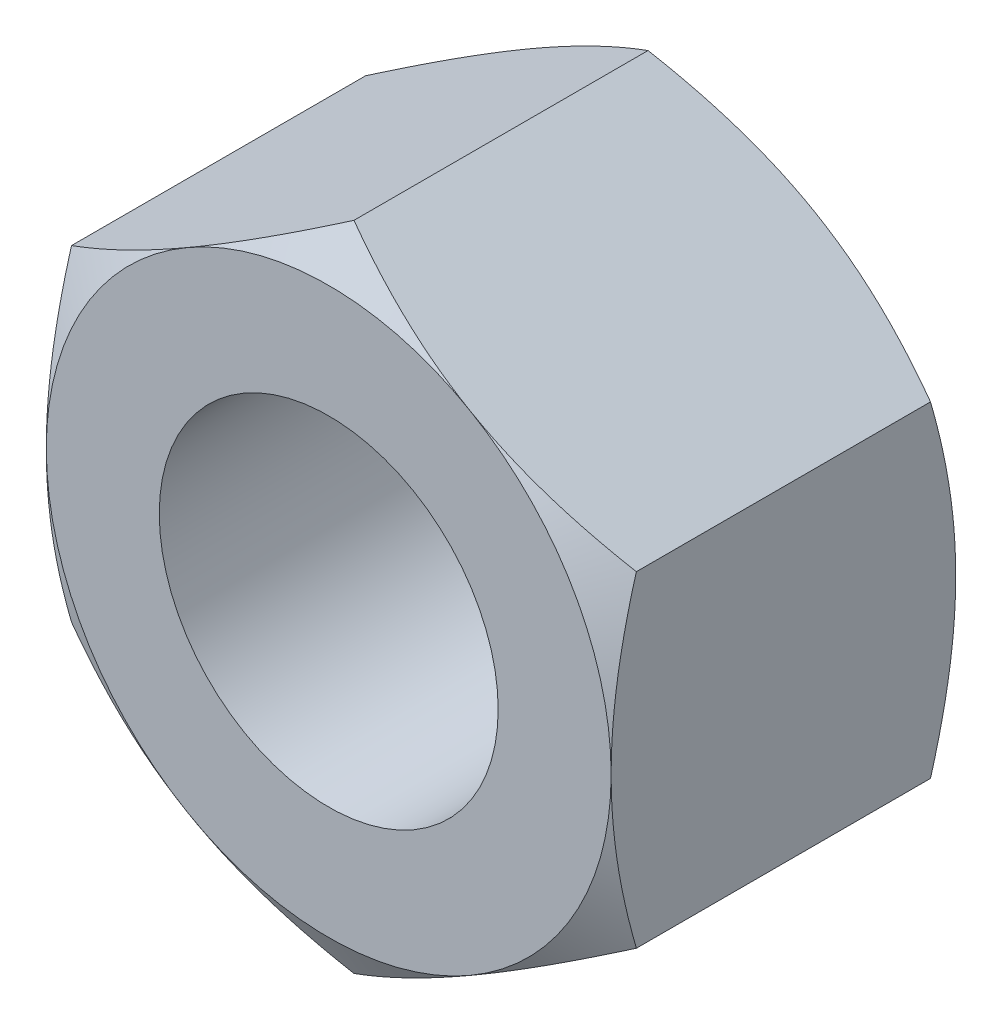
ISO-10303-21;
HEADER;
FILE_DESCRIPTION(('STEP AP214'),'2;1');
FILE_NAME('part.step','',(''),(''),'','','');
FILE_SCHEMA(('AUTOMOTIVE_DESIGN { 1 0 10303 214 1 1 1 1 }'));
ENDSEC;
DATA;
#1=APPLICATION_CONTEXT('core data for automotive mechanical design processes');
#2=APPLICATION_PROTOCOL_DEFINITION('international standard','automotive_design',2000,#1);
#3=PRODUCT_CONTEXT('',#1,'mechanical');
#4=PRODUCT('Part','Part','',(#3));
#5=PRODUCT_RELATED_PRODUCT_CATEGORY('part','',(#4));
#6=PRODUCT_DEFINITION_FORMATION('','',#4);
#7=PRODUCT_DEFINITION_CONTEXT('part definition',#1,'design');
#8=PRODUCT_DEFINITION('design','',#6,#7);
#9=PRODUCT_DEFINITION_SHAPE('','',#8);
#10=(LENGTH_UNIT() NAMED_UNIT(*) SI_UNIT(.MILLI.,.METRE.));
#11=(NAMED_UNIT(*) PLANE_ANGLE_UNIT() SI_UNIT($,.RADIAN.));
#12=(NAMED_UNIT(*) SI_UNIT($,.STERADIAN.) SOLID_ANGLE_UNIT());
#13=UNCERTAINTY_MEASURE_WITH_UNIT(LENGTH_MEASURE(1.E-05),#10,'distance_accuracy_value','');
#14=(GEOMETRIC_REPRESENTATION_CONTEXT(3) GLOBAL_UNCERTAINTY_ASSIGNED_CONTEXT((#13)) GLOBAL_UNIT_ASSIGNED_CONTEXT((#10,
#11,#12)) REPRESENTATION_CONTEXT('',''));
#15=CARTESIAN_POINT('',(0.,0.,0.));
#16=DIRECTION('',(0.,0.,1.));
#17=DIRECTION('',(1.,0.,0.));
#18=AXIS2_PLACEMENT_3D('',#15,#16,#17);
#19=CARTESIAN_POINT('',(-4.44089209850063E-13,5.77350269189662,-6.09999999999961));
#20=DIRECTION('',(-0.500000000000003,0.866025403784439,0.));
#21=DIRECTION('',(-0.86602540378444,-0.500000000000003,0.));
#22=AXIS2_PLACEMENT_3D('',#19,#20,#21);
#23=PLANE('',#22);
#24=DIRECTION('',(0.,0.,1.));
#25=VECTOR('',#24,1.);
#26=CARTESIAN_POINT('',(-5.00000000000037,2.88675134594854,-6.09999999999978));
#27=LINE('',#26,#25);
#28=CARTESIAN_POINT('',(-5.00000000000008,2.88675134594844,-5.65341801261451));
#29=VERTEX_POINT('',#28);
#30=CARTESIAN_POINT('',(-5.00000000000018,2.88675134594836,-0.446581987384988));
#31=VERTEX_POINT('',#30);
#32=EDGE_CURVE('E179',#29,#31,#27,.T.);
#33=ORIENTED_EDGE('',*,*,#32,.T.);
#34=CARTESIAN_POINT('',(-5.00020000000022,2.88663587589458,-0.446648656051575));
#35=CARTESIAN_POINT('',(-4.78046540547503,3.01349970319407,-0.373386567637683));
#36=CARTESIAN_POINT('',(-4.55885141554065,3.14144859993893,-0.306751321918298));
#37=CARTESIAN_POINT('',(-4.11178600454673,3.3995619353217,-0.190438991011152));
#38=CARTESIAN_POINT('',(-3.88632664040946,3.52973095989768,-0.140803049916111));
#39=CARTESIAN_POINT('',(-3.43816769477669,3.78847564779844,-0.0635510254189462));
#40=CARTESIAN_POINT('',(-3.21553790689598,3.91701101576094,-0.0354203782836819));
#41=CARTESIAN_POINT('',(-2.88081009815359,4.11026620624374,-0.0101949219540346));
#42=CARTESIAN_POINT('',(-2.76915780319521,4.17472868879368,-0.00461345976992652));
#43=CARTESIAN_POINT('',(-2.54575002932639,4.30371322717566,0.000797783248367124));
#44=CARTESIAN_POINT('',(-2.43399455370975,4.36823528110603,0.000627741742006714));
#45=CARTESIAN_POINT('',(-2.12781576914937,4.54500768479186,-0.00775363179151925));
#46=CARTESIAN_POINT('',(-1.93349391403306,4.65719946015319,-0.0218297718973291));
#47=CARTESIAN_POINT('',(-1.54613989800279,4.88083840558032,-0.0664652571099277));
#48=CARTESIAN_POINT('',(-1.35310909862887,4.99228478956061,-0.0970398601478299));
#49=CARTESIAN_POINT('',(-0.964974657525557,5.21637431361327,-0.173468493621365));
#50=CARTESIAN_POINT('',(-0.769920001358703,5.32898917185793,-0.219646378878941));
#51=CARTESIAN_POINT('',(-0.382719654641699,5.55253939626534,-0.324451794492138));
#52=CARTESIAN_POINT('',(-0.190569004592382,5.66347762579628,-0.383054703437459));
#53=CARTESIAN_POINT('',(0.000199999999631051,5.77361816195039,-0.446648656051506));
#54=B_SPLINE_CURVE_WITH_KNOTS('',3,(#34,#35,#36,#37,#38,#39,#40,#41,#42,#43,#44,#45,#46,#47,#48,
#49,#50,#51,#52,#53),.UNSPECIFIED.,.F.,.F.,(4,2,2,2,2,2,2,2,2,4),(0.,0.792555841363004,
1.5870166005333,2.36181537487278,2.7488407607732,3.13585419177284,3.80962362599659,
4.48401723901164,5.17336882348902,5.86136694793687),.UNSPECIFIED.);
#55=CARTESIAN_POINT('',(-2.50000000000021,4.33012701892242,0.));
#56=VERTEX_POINT('',#55);
#57=EDGE_CURVE('E140',#31,#56,#54,.T.);
#58=ORIENTED_EDGE('',*,*,#57,.T.);
#59=CARTESIAN_POINT('',(-5.13478148889135E-13,5.77350269189635,-0.446581987384863));
#60=VERTEX_POINT('',#59);
#61=EDGE_CURVE('E59',#56,#60,#54,.T.);
#62=ORIENTED_EDGE('',*,*,#61,.T.);
#63=DIRECTION('',(0.,0.,1.));
#64=VECTOR('',#63,1.);
#65=CARTESIAN_POINT('',(-4.44089209850063E-13,5.77350269189662,-6.09999999999961));
#66=LINE('',#65,#64);
#67=CARTESIAN_POINT('',(-3.81639164714898E-13,5.77350269189633,-5.65341801261445));
#68=VERTEX_POINT('',#67);
#69=EDGE_CURVE('E158',#68,#60,#66,.T.);
#70=ORIENTED_EDGE('',*,*,#69,.F.);
#71=CARTESIAN_POINT('',(-5.00020000000016,2.88663587589454,-5.65335134394793));
#72=CARTESIAN_POINT('',(-4.78046540547506,3.01349970319405,-5.72661343236218));
#73=CARTESIAN_POINT('',(-4.5588514155407,3.1414485999389,-5.79324867808174));
#74=CARTESIAN_POINT('',(-4.11178600454681,3.39956193532165,-5.90956100898904));
#75=CARTESIAN_POINT('',(-3.88632664040955,3.5297309598976,-5.95919695008405));
#76=CARTESIAN_POINT('',(-3.43816769477683,3.78847564779838,-6.03644897458111));
#77=CARTESIAN_POINT('',(-3.21553790689616,3.91701101576093,-6.06457962171629));
#78=CARTESIAN_POINT('',(-2.88081009815371,4.11026620624363,-6.08980507804613));
#79=CARTESIAN_POINT('',(-2.76915780319529,4.17472868879351,-6.09538654023036));
#80=CARTESIAN_POINT('',(-2.54575002932656,4.30371322717568,-6.10079778324829));
#81=CARTESIAN_POINT('',(-2.43399455371005,4.3682352811063,-6.10062774174144));
#82=CARTESIAN_POINT('',(-2.12781576914973,4.54500768479236,-6.09224636820751));
#83=CARTESIAN_POINT('',(-1.93349391403315,4.65719946015334,-6.07817022810247));
#84=CARTESIAN_POINT('',(-1.54613989800266,4.8808384055802,-6.03353474289042));
#85=CARTESIAN_POINT('',(-1.35310909862881,4.99228478956058,-6.00296013985229));
#86=CARTESIAN_POINT('',(-0.964974657525561,5.21637431361334,-5.92653150637861));
#87=CARTESIAN_POINT('',(-0.769920001358709,5.328989171858,-5.88035362112111));
#88=CARTESIAN_POINT('',(-0.382719654641654,5.5525393962653,-5.77554820550786));
#89=CARTESIAN_POINT('',(-0.190569004592283,5.66347762579611,-5.71694529656241));
#90=CARTESIAN_POINT('',(0.00019999999976289,5.77361816195001,-5.65335134394786));
#91=B_SPLINE_CURVE_WITH_KNOTS('',3,(#71,#72,#73,#74,#75,#76,#77,#78,#79,#80,#81,#82,#83,#84,#85,
#86,#87,#88,#89,#90),.UNSPECIFIED.,.F.,.F.,(4,2,2,2,2,2,2,2,2,4),(0.,0.792555841363085,
1.58701660053328,2.36181537487273,2.74884076077317,3.13585419177287,3.80962362599669,
4.48401723901176,5.1733688234891,5.86136694793705),.UNSPECIFIED.);
#92=CARTESIAN_POINT('',(-2.50000000000057,4.33012701892258,-6.09999999999992));
#93=VERTEX_POINT('',#92);
#94=EDGE_CURVE('E240',#93,#68,#91,.T.);
#95=ORIENTED_EDGE('',*,*,#94,.F.);
#96=EDGE_CURVE('E234',#29,#93,#91,.T.);
#97=ORIENTED_EDGE('',*,*,#96,.F.);
#98=EDGE_LOOP('',(#33,#58,#62,#70,#95,#97));
#99=FACE_BOUND('',#98,.T.);
#100=ADVANCED_FACE('F42',(#99),#23,.T.);
#101=CARTESIAN_POINT('',(4.99999999999994,2.88675134594867,-6.09999999999995));
#102=DIRECTION('',(0.500000000000004,0.866025403784438,0.));
#103=DIRECTION('',(-0.866025403784438,0.500000000000004,0.));
#104=AXIS2_PLACEMENT_3D('',#101,#102,#103);
#105=PLANE('',#104);
#106=ORIENTED_EDGE('',*,*,#69,.T.);
#107=CARTESIAN_POINT('',(-0.000200000000477596,5.77361816195005,-0.446648656051464));
#108=CARTESIAN_POINT('',(0.219534594525016,5.646754334651,-0.373386567637672));
#109=CARTESIAN_POINT('',(0.441148584459538,5.51880543790635,-0.306751321918319));
#110=CARTESIAN_POINT('',(0.888213995453589,5.26069210252375,-0.190438991011183));
#111=CARTESIAN_POINT('',(1.11367335959084,5.13052307794774,-0.14080304991612));
#112=CARTESIAN_POINT('',(1.56183230522357,4.87177839004686,-0.0635510254189315));
#113=CARTESIAN_POINT('',(1.78446209310425,4.74324302208427,-0.0354203782836669));
#114=CARTESIAN_POINT('',(2.11918990184676,4.54998783160166,-0.0101949219539971));
#115=CARTESIAN_POINT('',(2.23084219680521,4.48552534905183,-0.00461345976987793));
#116=CARTESIAN_POINT('',(2.45424997067384,4.35654081066949,0.000797783248400066));
#117=CARTESIAN_POINT('',(2.56600544629021,4.29201875673865,0.00062774174201291));
#118=CARTESIAN_POINT('',(2.87218423085038,4.11524635305244,-0.00775363179152954));
#119=CARTESIAN_POINT('',(3.06650608596711,4.00305457769185,-0.0218297718972858));
#120=CARTESIAN_POINT('',(3.45386010199769,3.77941563226527,-0.0664652571098393));
#121=CARTESIAN_POINT('',(3.64689090137148,3.66796924828479,-0.0970398601477501));
#122=CARTESIAN_POINT('',(4.0350253424747,3.443879724232,-0.173468493621276));
#123=CARTESIAN_POINT('',(4.23007999864159,3.33126486598742,-0.219646378878833));
#124=CARTESIAN_POINT('',(4.61728034535857,3.10771464158001,-0.324451794492037));
#125=CARTESIAN_POINT('',(4.80943099540783,2.996776412049,-0.383054703437384));
#126=CARTESIAN_POINT('',(5.0001999999996,2.88663587589454,-0.446648656051513));
#127=B_SPLINE_CURVE_WITH_KNOTS('',3,(#107,#108,#109,#110,#111,#112,#113,#114,#115,#116,#117,
#118,#119,#120,#121,#122,#123,#124,#125,#126),.UNSPECIFIED.,.F.,.F.,(4,2,2,2,2,2,2,2,2,4),(0.,
0.792555841363042,1.58701660053337,2.36181537487289,2.74884076077333,3.13585419177299,
3.80962362599671,4.48401723901174,5.17336882348908,5.86136694793691),.UNSPECIFIED.);
#128=CARTESIAN_POINT('',(2.50000000000002,4.33012701892229,4.16333634234434E-13));
#129=VERTEX_POINT('',#128);
#130=EDGE_CURVE('E150',#60,#129,#127,.T.);
#131=ORIENTED_EDGE('',*,*,#130,.T.);
#132=CARTESIAN_POINT('',(4.9999999999998,2.88675134594839,-0.446581987384863));
#133=VERTEX_POINT('',#132);
#134=EDGE_CURVE('E66',#129,#133,#127,.T.);
#135=ORIENTED_EDGE('',*,*,#134,.T.);
#136=DIRECTION('',(0.,0.,1.));
#137=VECTOR('',#136,1.);
#138=CARTESIAN_POINT('',(4.99999999999994,2.88675134594867,-6.09999999999995));
#139=LINE('',#138,#137);
#140=CARTESIAN_POINT('',(5.00000000000002,2.88675134594835,-5.65341801261473));
#141=VERTEX_POINT('',#140);
#142=EDGE_CURVE('E149',#141,#133,#139,.T.);
#143=ORIENTED_EDGE('',*,*,#142,.F.);
#144=CARTESIAN_POINT('',(-0.000200000000234735,5.77361816194973,-5.65335134394779));
#145=CARTESIAN_POINT('',(0.219534594525177,5.64675433465085,-5.72661343236206));
#146=CARTESIAN_POINT('',(0.441148584459652,5.51880543790627,-5.79324867808162));
#147=CARTESIAN_POINT('',(0.888213995453606,5.26069210252376,-5.90956100898889));
#148=CARTESIAN_POINT('',(1.11367335959081,5.13052307794776,-5.95919695008389));
#149=CARTESIAN_POINT('',(1.56183230522344,4.87177839004693,-6.03644897458096));
#150=CARTESIAN_POINT('',(1.78446209310408,4.74324302208438,-6.06457962171617));
#151=CARTESIAN_POINT('',(2.11918990184653,4.54998783160178,-6.08980507804595));
#152=CARTESIAN_POINT('',(2.23084219680495,4.48552534905195,-6.09538654023015));
#153=CARTESIAN_POINT('',(2.45424997067358,4.35654081066966,-6.10079778324819));
#154=CARTESIAN_POINT('',(2.56600544628997,4.29201875673888,-6.10062774174149));
#155=CARTESIAN_POINT('',(2.87218423085021,4.11524635305268,-6.09224636820769));
#156=CARTESIAN_POINT('',(3.06650608596696,4.00305457769198,-6.07817022810242));
#157=CARTESIAN_POINT('',(3.45386010199759,3.77941563226529,-6.03353474289021));
#158=CARTESIAN_POINT('',(3.64689090137143,3.66796924828481,-6.00296013985216));
#159=CARTESIAN_POINT('',(4.03502534247471,3.443879724232,-5.9265315063785));
#160=CARTESIAN_POINT('',(4.23007999864161,3.33126486598738,-5.88035362112096));
#161=CARTESIAN_POINT('',(4.61728034535868,3.10771464157995,-5.77554820550776));
#162=CARTESIAN_POINT('',(4.809430995408,2.99677641204896,-5.71694529656239));
#163=CARTESIAN_POINT('',(5.00019999999986,2.88663587589458,-5.65335134394811));
#164=B_SPLINE_CURVE_WITH_KNOTS('',3,(#144,#145,#146,#147,#148,#149,#150,#151,#152,#153,#154,
#155,#156,#157,#158,#159,#160,#161,#162,#163),.UNSPECIFIED.,.F.,.F.,(4,2,2,2,2,2,2,2,2,4),(0.,
0.792555841362966,1.58701660053309,2.36181537487245,2.74884076077284,3.13585419177248,
3.80962362599636,4.48401723901151,5.17336882348895,5.86136694793695),.UNSPECIFIED.);
#165=CARTESIAN_POINT('',(2.49999999999948,4.3301270189228,-6.09999999999961));
#166=VERTEX_POINT('',#165);
#167=EDGE_CURVE('E251',#166,#141,#164,.T.);
#168=ORIENTED_EDGE('',*,*,#167,.F.);
#169=EDGE_CURVE('E255',#68,#166,#164,.T.);
#170=ORIENTED_EDGE('',*,*,#169,.F.);
#171=EDGE_LOOP('',(#106,#131,#135,#143,#168,#170));
#172=FACE_BOUND('',#171,.T.);
#173=ADVANCED_FACE('F147',(#172),#105,.T.);
#174=CARTESIAN_POINT('',(4.99999999999994,2.88675134594867,-6.09999999999995));
#175=DIRECTION('',(-0.999999999999999,0.,0.));
#176=DIRECTION('',(0.,0.,1.));
#177=AXIS2_PLACEMENT_3D('',#174,#175,#176);
#178=PLANE('',#177);
#179=CARTESIAN_POINT('',(4.99999999999953,-7.65608998744858,-2.39263352655083));
#180=CARTESIAN_POINT('',(4.99999999999979,-7.43656171400159,-2.28654533817205));
#181=CARTESIAN_POINT('',(4.9999999999999,-7.21651440170012,-2.18151175461591));
#182=CARTESIAN_POINT('',(4.99999999999998,-6.77510105921504,-1.97415643363968));
#183=CARTESIAN_POINT('',(4.99999999999995,-6.55373480873035,-1.87183516574559));
#184=CARTESIAN_POINT('',(4.99999999999993,-6.10820714710332,-1.66996807853479));
#185=CARTESIAN_POINT('',(4.99999999999994,-5.88403698971095,-1.57044149281716));
#186=CARTESIAN_POINT('',(4.99999999999994,-5.43385418074639,-1.37566323278663));
#187=CARTESIAN_POINT('',(4.99999999999994,-5.20784162594235,-1.28041133564223));
#188=CARTESIAN_POINT('',(4.99999999999994,-4.75080884782709,-1.09418830918921));
#189=CARTESIAN_POINT('',(4.99999999999994,-4.51976121099458,-1.00328409099851));
#190=CARTESIAN_POINT('',(4.99999999999994,-4.05494053422052,-0.828595302971745));
#191=CARTESIAN_POINT('',(4.99999999999994,-3.82116719433978,-0.744811525247423));
#192=CARTESIAN_POINT('',(4.99999999999995,-3.3510041671184,-0.586614632364477));
#193=CARTESIAN_POINT('',(4.99999999999997,-3.11462125088137,-0.512181595225238));
#194=CARTESIAN_POINT('',(4.99999999999992,-2.63849247869981,-0.375104393872088));
#195=CARTESIAN_POINT('',(4.99999999999986,-2.39874771210299,-0.312456501596295));
#196=CARTESIAN_POINT('',(4.99999999999986,-1.91574303714471,-0.201987753994244));
#197=CARTESIAN_POINT('',(4.99999999999992,-1.67248221084069,-0.154170846558412));
#198=CARTESIAN_POINT('',(4.99999999999996,-1.18299359688632,-0.0765955557924681));
#199=CARTESIAN_POINT('',(4.99999999999994,-0.936765806613002,-0.0468371884283754));
#200=CARTESIAN_POINT('',(4.99999999999994,-0.567032279323598,-0.0176512015862332));
#201=CARTESIAN_POINT('',(4.99999999999995,-0.444105297658289,-0.0104963190598937));
#202=CARTESIAN_POINT('',(4.99999999999994,-0.198053005238315,-0.00139545226900896));
#203=CARTESIAN_POINT('',(4.99999999999993,-0.0749276970799807,0.000550599639634887));
#204=CARTESIAN_POINT('',(4.99999999999996,0.171257999892599,-0.000818470345620542));
#205=CARTESIAN_POINT('',(4.99999999999999,0.294318397227333,-0.00413211431293344));
#206=CARTESIAN_POINT('',(4.99999999999989,0.540192730789074,-0.015936597282795));
#207=CARTESIAN_POINT('',(4.99999999999975,0.663006654263705,-0.0244276975703479));
#208=CARTESIAN_POINT('',(4.99999999999968,0.9606818728819,-0.051106380275563));
#209=CARTESIAN_POINT('',(4.99999999999987,1.13531436279966,-0.07188896769836));
#210=CARTESIAN_POINT('',(5.00000000000001,1.48321675799419,-0.12276565572264));
#211=CARTESIAN_POINT('',(4.99999999999996,1.65648647841267,-0.152860997990039));
#212=CARTESIAN_POINT('',(4.99999999999992,2.0015542605873,-0.221298792011608));
#213=CARTESIAN_POINT('',(4.99999999999994,2.17335067370404,-0.259649477486453));
#214=CARTESIAN_POINT('',(4.99999999999995,2.51518168221086,-0.343428305385061));
#215=CARTESIAN_POINT('',(4.99999999999994,2.68521638419343,-0.38885601691406));
#216=CARTESIAN_POINT('',(4.99999999999994,3.02770318928922,-0.48688778205436));
#217=CARTESIAN_POINT('',(4.99999999999994,3.2001124843534,-0.539640363824009));
#218=CARTESIAN_POINT('',(4.99999999999994,3.54310870430201,-0.650357787302677));
#219=CARTESIAN_POINT('',(4.99999999999994,3.71369679659738,-0.708319033907106));
#220=CARTESIAN_POINT('',(4.99999999999994,4.05236610267992,-0.828256540728539));
#221=CARTESIAN_POINT('',(4.99999999999993,4.22045602230071,-0.890208365426474));
#222=CARTESIAN_POINT('',(4.99999999999995,4.55533171687464,-1.01774823413809));
#223=CARTESIAN_POINT('',(4.99999999999997,4.72211693321436,-1.08333774778755));
#224=CARTESIAN_POINT('',(5.00000000000002,4.88829623733392,-1.15038625817658));
#225=B_SPLINE_CURVE_WITH_KNOTS('',3,(#179,#180,#181,#182,#183,#184,#185,#186,#187,#188,#189,
#190,#191,#192,#193,#194,#195,#196,#197,#198,#199,#200,#201,#202,#203,#204,#205,#206,#207,#208,
#209,#210,#211,#212,#213,#214,#215,#216,#217,#218,#219,#220,#221,#222,#223,#224),.UNSPECIFIED.,
.F.,.F.,(4,2,2,2,2,2,2,2,2,2,2,2,2,2,2,2,2,2,2,2,2,2,4),(0.,0.731464740665432,1.46305528824926,
2.19883243307519,2.9345711785608,3.67934251246904,4.42419659013408,5.16743580872035,
5.91043951739378,6.65364083834838,7.39684281638541,7.76615414335481,8.13546067426635,
8.50466345177879,8.87388486298476,9.40118542949755,9.92855633110045,10.4564556797857,
10.9843228991238,11.5251202808283,12.0655472210642,12.6029322754132,13.1405360390027),.UNSPECIFIED.);
#226=CARTESIAN_POINT('',(4.99999999999948,-2.88675134594791,-0.446581987384564));
#227=VERTEX_POINT('',#226);
#228=CARTESIAN_POINT('',(5.00000000000005,1.66533453693773E-13,1.11022302462516E-13));
#229=VERTEX_POINT('',#228);
#230=EDGE_CURVE('E142',#227,#229,#225,.T.);
#231=ORIENTED_EDGE('',*,*,#230,.F.);
#232=DIRECTION('',(0.,0.,1.));
#233=VECTOR('',#232,1.);
#234=CARTESIAN_POINT('',(4.99999999999966,-2.88675134594801,-6.09999999999936));
#235=LINE('',#234,#233);
#236=CARTESIAN_POINT('',(4.99999999999972,-2.8867513459479,-5.65341801261417));
#237=VERTEX_POINT('',#236);
#238=EDGE_CURVE('E159',#237,#227,#235,.T.);
#239=ORIENTED_EDGE('',*,*,#238,.F.);
#240=CARTESIAN_POINT('',(4.99999999999985,-7.65608998744842,-3.70736647344916));
#241=CARTESIAN_POINT('',(4.99999999999991,-7.43656171400143,-3.81345466182782));
#242=CARTESIAN_POINT('',(4.99999999999993,-7.21651440169999,-3.9184882453839));
#243=CARTESIAN_POINT('',(4.99999999999995,-6.77510105921499,-4.12584356636005));
#244=CARTESIAN_POINT('',(4.99999999999994,-6.55373480873036,-4.22816483425412));
#245=CARTESIAN_POINT('',(4.99999999999994,-6.10820714710347,-4.43003192146487));
#246=CARTESIAN_POINT('',(4.99999999999994,-5.88403698971118,-4.52955850718246));
#247=CARTESIAN_POINT('',(4.99999999999994,-5.43385418074677,-4.72433676721291));
#248=CARTESIAN_POINT('',(4.99999999999994,-5.20784162594281,-4.81958866435728));
#249=CARTESIAN_POINT('',(4.99999999999994,-4.75080884782761,-5.0058116908103));
#250=CARTESIAN_POINT('',(4.99999999999994,-4.51976121099509,-5.09671590900102));
#251=CARTESIAN_POINT('',(4.99999999999994,-4.05494053422101,-5.27140469702776));
#252=CARTESIAN_POINT('',(4.99999999999993,-3.82116719434024,-5.35518847475204));
#253=CARTESIAN_POINT('',(4.99999999999995,-3.35100416711888,-5.51338536763514));
#254=CARTESIAN_POINT('',(4.99999999999997,-3.11462125088187,-5.58781840477458));
#255=CARTESIAN_POINT('',(4.99999999999991,-2.63849247870013,-5.72489560612725));
#256=CARTESIAN_POINT('',(4.99999999999984,-2.3987477121031,-5.78754349840237));
#257=CARTESIAN_POINT('',(4.99999999999984,-1.9157430371447,-5.89801224600446));
#258=CARTESIAN_POINT('',(4.99999999999991,-1.67248221084077,-5.94582915344101));
#259=CARTESIAN_POINT('',(4.99999999999997,-1.1829935968864,-6.02340444420749));
#260=CARTESIAN_POINT('',(4.99999999999995,-0.936765806612989,-6.05316281157139));
#261=CARTESIAN_POINT('',(4.99999999999994,-0.567032279323516,-6.08234879841345));
#262=CARTESIAN_POINT('',(4.99999999999994,-0.444105297658206,-6.0895036809398));
#263=CARTESIAN_POINT('',(4.99999999999994,-0.198053005238223,-6.09860454773073));
#264=CARTESIAN_POINT('',(4.99999999999993,-0.0749276970798792,-6.1005505996394));
#265=CARTESIAN_POINT('',(4.99999999999995,0.171257999892707,-6.09918152965405));
#266=CARTESIAN_POINT('',(4.99999999999997,0.294318397227438,-6.09586788568661));
#267=CARTESIAN_POINT('',(4.99999999999991,0.540192730789209,-6.0840634027171));
#268=CARTESIAN_POINT('',(4.99999999999984,0.663006654263873,-6.07557230243003));
#269=CARTESIAN_POINT('',(4.9999999999998,0.960681872882042,-6.04889361972505));
#270=CARTESIAN_POINT('',(4.9999999999999,1.13531436279971,-6.02811103230162));
#271=CARTESIAN_POINT('',(4.99999999999998,1.48321675799415,-5.97723434427688));
#272=CARTESIAN_POINT('',(4.99999999999995,1.65648647841263,-5.94713900200966));
#273=CARTESIAN_POINT('',(4.99999999999993,2.00155426058728,-5.87870120798823));
#274=CARTESIAN_POINT('',(4.99999999999994,2.17335067370403,-5.84035052251334));
#275=CARTESIAN_POINT('',(4.99999999999994,2.51518168221085,-5.75657169461471));
#276=CARTESIAN_POINT('',(4.99999999999994,2.68521638419342,-5.71114398308572));
#277=CARTESIAN_POINT('',(4.99999999999994,3.02770318928928,-5.61311221794543));
#278=CARTESIAN_POINT('',(4.99999999999994,3.20011248435352,-5.56035963617577));
#279=CARTESIAN_POINT('',(4.99999999999994,3.54310870430224,-5.44964221269705));
#280=CARTESIAN_POINT('',(4.99999999999993,3.71369679659765,-5.39168096609259));
#281=CARTESIAN_POINT('',(4.99999999999995,4.05236610268029,-5.27174345927118));
#282=CARTESIAN_POINT('',(4.99999999999997,4.22045602230114,-5.2097916345733));
#283=CARTESIAN_POINT('',(4.99999999999991,4.55533171687509,-5.08225176586147));
#284=CARTESIAN_POINT('',(4.99999999999984,4.72211693321475,-5.01666225221174));
#285=CARTESIAN_POINT('',(4.99999999999965,4.88829623733411,-4.94961374182207));
#286=B_SPLINE_CURVE_WITH_KNOTS('',3,(#240,#241,#242,#243,#244,#245,#246,#247,#248,#249,#250,
#251,#252,#253,#254,#255,#256,#257,#258,#259,#260,#261,#262,#263,#264,#265,#266,#267,#268,#269,
#270,#271,#272,#273,#274,#275,#276,#277,#278,#279,#280,#281,#282,#283,#284,#285),.UNSPECIFIED.,
.F.,.F.,(4,2,2,2,2,2,2,2,2,2,2,2,2,2,2,2,2,2,2,2,2,2,4),(0.,0.731464740665279,1.46305528824893,
2.19883243307459,2.93457117855996,3.67934251246825,4.42419659013331,5.16743580871963,
5.9104395173932,6.65364083834797,7.39684281638515,7.76615414335457,8.13546067426613,
8.50466345177859,8.87388486298455,9.40118542949725,9.92855633110012,10.4564556797854,
10.9843228991235,11.5251202808282,12.0655472210643,12.6029322754134,13.140536039003),.UNSPECIFIED.);
#287=CARTESIAN_POINT('',(4.99999999999971,1.04083408558608E-13,-6.09999999999986));
#288=VERTEX_POINT('',#287);
#289=EDGE_CURVE('E218',#237,#288,#286,.T.);
#290=ORIENTED_EDGE('',*,*,#289,.T.);
#291=EDGE_CURVE('E156',#288,#141,#286,.T.);
#292=ORIENTED_EDGE('',*,*,#291,.T.);
#293=ORIENTED_EDGE('',*,*,#142,.T.);
#294=EDGE_CURVE('E131',#229,#133,#225,.T.);
#295=ORIENTED_EDGE('',*,*,#294,.F.);
#296=EDGE_LOOP('',(#231,#239,#290,#292,#293,#295));
#297=FACE_BOUND('',#296,.T.);
#298=ADVANCED_FACE('F154',(#297),#178,.F.);
#299=CARTESIAN_POINT('',(-3.19189119579733E-13,-5.773502691896,-6.09999999999997));
#300=DIRECTION('',(0.500000000000003,-0.866025403784439,0.));
#301=DIRECTION('',(0.866025403784439,0.500000000000003,0.));
#302=AXIS2_PLACEMENT_3D('',#299,#300,#301);
#303=PLANE('',#302);
#304=ORIENTED_EDGE('',*,*,#238,.T.);
#305=CARTESIAN_POINT('',(5.00019999999959,-2.88663587589398,-0.446648656051221));
#306=CARTESIAN_POINT('',(4.78046540547441,-3.01349970319343,-0.373386567637244));
#307=CARTESIAN_POINT('',(4.55885141554003,-3.14144859993825,-0.3067513219178));
#308=CARTESIAN_POINT('',(4.11178600454614,-3.39956193532096,-0.190438991010601));
#309=CARTESIAN_POINT('',(3.8863266404089,-3.52973095989691,-0.140803049915563));
#310=CARTESIAN_POINT('',(3.43816769477621,-3.78847564779769,-0.0635510254184523));
#311=CARTESIAN_POINT('',(3.21553790689556,-3.91701101576023,-0.0354203782832394));
#312=CARTESIAN_POINT('',(2.88081009815313,-4.11026620624289,-0.0101949219534691));
#313=CARTESIAN_POINT('',(2.76915780319472,-4.17472868879275,-0.00461345976928685));
#314=CARTESIAN_POINT('',(2.54575002932604,-4.30371322717496,0.000797783248782585));
#315=CARTESIAN_POINT('',(2.43399455370958,-4.36823528110563,0.000627741742123498));
#316=CARTESIAN_POINT('',(2.1278157691493,-4.54500768479174,-0.00775363179164737));
#317=CARTESIAN_POINT('',(1.93349391403266,-4.65719946015261,-0.0218297718969806));
#318=CARTESIAN_POINT('',(1.54613989800211,-4.88083840557942,-0.0664652571092529));
#319=CARTESIAN_POINT('',(1.35310909862825,-4.99228478955984,-0.0970398601473051));
#320=CARTESIAN_POINT('',(0.964974657524963,-5.21637431361262,-0.173468493620937));
#321=CARTESIAN_POINT('',(0.769920001358062,-5.32898917185726,-0.219646378878455));
#322=CARTESIAN_POINT('',(0.382719654641025,-5.55253939626466,-0.324451794491765));
#323=CARTESIAN_POINT('',(0.19056900459172,-5.66347762579561,-0.383054703437258));
#324=CARTESIAN_POINT('',(-0.00020000000013759,-5.77361816194984,-0.446648656051804));
#325=B_SPLINE_CURVE_WITH_KNOTS('',3,(#305,#306,#307,#308,#309,#310,#311,#312,#313,#314,#315,
#316,#317,#318,#319,#320,#321,#322,#323,#324),.UNSPECIFIED.,.F.,.F.,(4,2,2,2,2,2,2,2,2,4),(0.,
0.792555841362991,1.58701660053316,2.36181537487256,2.74884076077296,3.1358541917726,
3.80962362599646,4.48401723901159,5.17336882348902,5.86136694793701),.UNSPECIFIED.);
#326=CARTESIAN_POINT('',(2.49999999999992,-4.33012701892174,4.37150315946155E-13));
#327=VERTEX_POINT('',#326);
#328=EDGE_CURVE('E323',#227,#327,#325,.T.);
#329=ORIENTED_EDGE('',*,*,#328,.T.);
#330=CARTESIAN_POINT('',(-3.01841884819964E-13,-5.77350269189589,-0.446581987385154));
#331=VERTEX_POINT('',#330);
#332=EDGE_CURVE('E315',#327,#331,#325,.T.);
#333=ORIENTED_EDGE('',*,*,#332,.T.);
#334=DIRECTION('',(0.,0.,1.));
#335=VECTOR('',#334,1.);
#336=CARTESIAN_POINT('',(-3.19189119579733E-13,-5.773502691896,-6.09999999999997));
#337=LINE('',#336,#335);
#338=CARTESIAN_POINT('',(-1.11022302462516E-13,-5.77350269189592,-5.65341801261478));
#339=VERTEX_POINT('',#338);
#340=EDGE_CURVE('E168',#339,#331,#337,.T.);
#341=ORIENTED_EDGE('',*,*,#340,.F.);
#342=CARTESIAN_POINT('',(5.00019999999986,-2.88663587589397,-5.65335134394749));
#343=CARTESIAN_POINT('',(4.78046540547469,-3.01349970319332,-5.72661343236203));
#344=CARTESIAN_POINT('',(4.55885141554026,-3.14144859993813,-5.79324867808174));
#345=CARTESIAN_POINT('',(4.11178600454626,-3.39956193532088,-5.90956100898917));
#346=CARTESIAN_POINT('',(3.88632664040896,-3.52973095989688,-5.95919695008418));
#347=CARTESIAN_POINT('',(3.43816769477615,-3.78847564779772,-6.03644897458123));
#348=CARTESIAN_POINT('',(3.21553790689543,-3.91701101576029,-6.06457962171641));
#349=CARTESIAN_POINT('',(2.88081009815292,-4.11026620624303,-6.08980507804631));
#350=CARTESIAN_POINT('',(2.76915780319447,-4.17472868879292,-6.09538654023056));
#351=CARTESIAN_POINT('',(2.54575002932569,-4.30371322717513,-6.10079778324841));
#352=CARTESIAN_POINT('',(2.43399455370915,-4.36823528110576,-6.10062774174146));
#353=CARTESIAN_POINT('',(2.12781576914882,-4.54500768479182,-6.09224636820744));
#354=CARTESIAN_POINT('',(1.93349391403226,-4.65719946015278,-6.07817022810257));
#355=CARTESIAN_POINT('',(1.54613989800182,-4.88083840557963,-6.03353474289064));
#356=CARTESIAN_POINT('',(1.353109098628,-4.99228478956001,-6.00296013985247));
#357=CARTESIAN_POINT('',(0.964974657524797,-5.2163743136127,-5.92653150637876));
#358=CARTESIAN_POINT('',(0.76992000135795,-5.3289891718573,-5.88035362112128));
#359=CARTESIAN_POINT('',(0.38271965464101,-5.55253939626469,-5.77554820550806));
#360=CARTESIAN_POINT('',(0.190569004591749,-5.66347762579564,-5.71694529656262));
#361=CARTESIAN_POINT('',(-0.000200000000061262,-5.77361816194989,-5.65335134394806));
#362=B_SPLINE_CURVE_WITH_KNOTS('',3,(#342,#343,#344,#345,#346,#347,#348,#349,#350,#351,#352,
#353,#354,#355,#356,#357,#358,#359,#360,#361),.UNSPECIFIED.,.F.,.F.,(4,2,2,2,2,2,2,2,2,4),(0.,
0.79255584136329,1.58701660053365,2.36181537487325,2.74884076077378,3.13585419177358,
3.80962362599732,4.48401723901229,5.17336882348953,5.8613669479374),.UNSPECIFIED.);
#363=CARTESIAN_POINT('',(2.49999999999954,-4.33012701892194,-6.09999999999964));
#364=VERTEX_POINT('',#363);
#365=EDGE_CURVE('E242',#364,#339,#362,.T.);
#366=ORIENTED_EDGE('',*,*,#365,.F.);
#367=EDGE_CURVE('E220',#237,#364,#362,.T.);
#368=ORIENTED_EDGE('',*,*,#367,.F.);
#369=EDGE_LOOP('',(#304,#329,#333,#341,#366,#368));
#370=FACE_BOUND('',#369,.T.);
#371=ADVANCED_FACE('F306',(#370),#303,.T.);
#372=CARTESIAN_POINT('',(-5.00000000000035,-2.88675134594799,-6.09999999999961));
#373=DIRECTION('',(-0.500000000000003,-0.866025403784437,0.));
#374=DIRECTION('',(0.866025403784437,-0.500000000000003,0.));
#375=AXIS2_PLACEMENT_3D('',#372,#373,#374);
#376=PLANE('',#375);
#377=ORIENTED_EDGE('',*,*,#340,.T.);
#378=CARTESIAN_POINT('',(0.000199999999641459,-5.77361816194977,-0.44664865605179));
#379=CARTESIAN_POINT('',(-0.219534594525562,-5.64675433465048,-0.37338656763756));
#380=CARTESIAN_POINT('',(-0.441148584459959,-5.51880543790573,-0.306751321918028));
#381=CARTESIAN_POINT('',(-0.888213995453892,-5.26069210252308,-0.190438991010779));
#382=CARTESIAN_POINT('',(-1.11367335959115,-5.1305230779471,-0.14080304991578));
#383=CARTESIAN_POINT('',(-1.56183230522385,-4.87177839004627,-0.0635510254186759));
#384=CARTESIAN_POINT('',(-1.7844620931045,-4.7432430220837,-0.0354203782834319));
#385=CARTESIAN_POINT('',(-2.11918990184697,-4.54998783160109,-0.010194921953739));
#386=CARTESIAN_POINT('',(-2.23084219680541,-4.48552534905126,-0.00461345976960311));
#387=CARTESIAN_POINT('',(-2.45424997067403,-4.35654081066895,0.000797783248584932));
#388=CARTESIAN_POINT('',(-2.56600544629041,-4.29201875673813,0.000627741742090996));
#389=CARTESIAN_POINT('',(-2.87218423085061,-4.1152463530519,-0.00775363179155288));
#390=CARTESIAN_POINT('',(-3.06650608596738,-4.00305457769127,-0.0218297718971659));
#391=CARTESIAN_POINT('',(-3.45386010199803,-3.77941563226463,-0.0664652571096386));
#392=CARTESIAN_POINT('',(-3.64689090137186,-3.66796924828414,-0.0970398601476117));
#393=CARTESIAN_POINT('',(-4.03502534247514,-3.44387972423129,-0.173468493621231));
#394=CARTESIAN_POINT('',(-4.23007999864204,-3.33126486598666,-0.219646378878819));
#395=CARTESIAN_POINT('',(-4.61728034535915,-3.10771464157929,-0.324451794492032));
#396=CARTESIAN_POINT('',(-4.80943099540852,-2.99677641204837,-0.383054703437358));
#397=CARTESIAN_POINT('',(-5.00020000000052,-2.88663587589415,-0.446648656051429));
#398=B_SPLINE_CURVE_WITH_KNOTS('',3,(#378,#379,#380,#381,#382,#383,#384,#385,#386,#387,#388,
#389,#390,#391,#392,#393,#394,#395,#396,#397),.UNSPECIFIED.,.F.,.F.,(4,2,2,2,2,2,2,2,2,4),(0.,
0.792555841363002,1.58701660053324,2.36181537487266,2.74884076077307,3.13585419177271,
3.80962362599658,4.48401723901173,5.17336882348921,5.8613669479372),.UNSPECIFIED.);
#399=CARTESIAN_POINT('',(-2.50000000000007,-4.3301270189221,3.12250225675825E-13));
#400=VERTEX_POINT('',#399);
#401=EDGE_CURVE('E324',#331,#400,#398,.T.);
#402=ORIENTED_EDGE('',*,*,#401,.T.);
#403=CARTESIAN_POINT('',(-5.00000000000043,-2.88675134594767,-0.446581987384814));
#404=VERTEX_POINT('',#403);
#405=EDGE_CURVE('E325',#400,#404,#398,.T.);
#406=ORIENTED_EDGE('',*,*,#405,.T.);
#407=DIRECTION('',(0.,0.,1.));
#408=VECTOR('',#407,1.);
#409=CARTESIAN_POINT('',(-5.00000000000035,-2.88675134594799,-6.09999999999961));
#410=LINE('',#409,#408);
#411=CARTESIAN_POINT('',(-5.00000000000018,-2.88675134594777,-5.6534180126144));
#412=VERTEX_POINT('',#411);
#413=EDGE_CURVE('E175',#412,#404,#410,.T.);
#414=ORIENTED_EDGE('',*,*,#413,.F.);
#415=CARTESIAN_POINT('',(0.000200000000040446,-5.77361816195002,-5.65335134394808));
#416=CARTESIAN_POINT('',(-0.219534594525242,-5.64675433465069,-5.7266134323622));
#417=CARTESIAN_POINT('',(-0.441148584459699,-5.51880543790589,-5.79324867808174));
#418=CARTESIAN_POINT('',(-0.888213995453703,-5.26069210252317,-5.90956100898903));
#419=CARTESIAN_POINT('',(-1.11367335959097,-5.13052307794719,-5.95919695008408));
#420=CARTESIAN_POINT('',(-1.56183230522374,-4.87177839004635,-6.03644897458117));
#421=CARTESIAN_POINT('',(-1.78446209310445,-4.74324302208378,-6.06457962171635));
#422=CARTESIAN_POINT('',(-2.11918990184695,-4.54998783160107,-6.08980507804623));
#423=CARTESIAN_POINT('',(-2.2308421968054,-4.4855253490512,-6.09538654023047));
#424=CARTESIAN_POINT('',(-2.45424997067414,-4.35654081066896,-6.10079778324836));
#425=CARTESIAN_POINT('',(-2.56600544629064,-4.29201875673827,-6.10062774174146));
#426=CARTESIAN_POINT('',(-2.87218423085095,-4.11524635305215,-6.09224636820748));
#427=CARTESIAN_POINT('',(-3.06650608596759,-4.00305457769127,-6.07817022810254));
#428=CARTESIAN_POINT('',(-3.45386010199812,-3.77941563226446,-6.03353474289056));
#429=CARTESIAN_POINT('',(-3.64689090137195,-3.66796924828405,-6.00296013985241));
#430=CARTESIAN_POINT('',(-4.03502534247519,-3.4438797242313,-5.92653150637872));
#431=CARTESIAN_POINT('',(-4.23007999864207,-3.33126486598666,-5.88035362112125));
#432=CARTESIAN_POINT('',(-4.61728034535908,-3.10771464157931,-5.77554820550796));
#433=CARTESIAN_POINT('',(-4.80943099540838,-2.99677641204841,-5.71694529656243));
#434=CARTESIAN_POINT('',(-5.00020000000025,-2.88663587589429,-5.65335134394771));
#435=B_SPLINE_CURVE_WITH_KNOTS('',3,(#415,#416,#417,#418,#419,#420,#421,#422,#423,#424,#425,
#426,#427,#428,#429,#430,#431,#432,#433,#434),.UNSPECIFIED.,.F.,.F.,(4,2,2,2,2,2,2,2,2,4),(0.,
0.792555841363208,1.58701660053352,2.36181537487308,2.74884076077358,3.13585419177335,
3.80962362599718,4.48401723901224,5.17336882348957,5.86136694793753),.UNSPECIFIED.);
#436=CARTESIAN_POINT('',(-2.50000000000036,-4.33012701892176,-6.09999999999972));
#437=VERTEX_POINT('',#436);
#438=EDGE_CURVE('E293',#437,#412,#435,.T.);
#439=ORIENTED_EDGE('',*,*,#438,.F.);
#440=EDGE_CURVE('E305',#339,#437,#435,.T.);
#441=ORIENTED_EDGE('',*,*,#440,.F.);
#442=EDGE_LOOP('',(#377,#402,#406,#414,#439,#441));
#443=FACE_BOUND('',#442,.T.);
#444=ADVANCED_FACE('F309',(#443),#376,.T.);
#445=CARTESIAN_POINT('',(-5.00000000000037,2.88675134594854,-6.09999999999978));
#446=DIRECTION('',(-0.999999999999999,0.,0.));
#447=DIRECTION('',(0.,0.,1.));
#448=AXIS2_PLACEMENT_3D('',#445,#446,#447);
#449=PLANE('',#448);
#450=ORIENTED_EDGE('',*,*,#413,.T.);
#451=CARTESIAN_POINT('',(-5.00000000000052,-7.6560899874485,-2.39263352655078));
#452=CARTESIAN_POINT('',(-5.00000000000043,-7.43656171400148,-2.28654533817209));
#453=CARTESIAN_POINT('',(-5.00000000000039,-7.21651440170002,-2.18151175461599));
#454=CARTESIAN_POINT('',(-5.00000000000036,-6.77510105921497,-1.9741564336398));
#455=CARTESIAN_POINT('',(-5.00000000000037,-6.5537348087303,-1.87183516574572));
#456=CARTESIAN_POINT('',(-5.00000000000038,-6.1082071471033,-1.66996807853493));
#457=CARTESIAN_POINT('',(-5.00000000000037,-5.88403698971094,-1.57044149281732));
#458=CARTESIAN_POINT('',(-5.00000000000037,-5.43385418074641,-1.37566323278681));
#459=CARTESIAN_POINT('',(-5.00000000000037,-5.2078416259424,-1.28041133564242));
#460=CARTESIAN_POINT('',(-5.00000000000037,-4.75080884782715,-1.09418830918941));
#461=CARTESIAN_POINT('',(-5.00000000000038,-4.51976121099464,-1.00328409099871));
#462=CARTESIAN_POINT('',(-5.00000000000037,-4.05494053422059,-0.828595302971964));
#463=CARTESIAN_POINT('',(-5.00000000000035,-3.82116719433985,-0.744811525247651));
#464=CARTESIAN_POINT('',(-5.0000000000004,-3.35100416711848,-0.586614632364704));
#465=CARTESIAN_POINT('',(-5.00000000000046,-3.11462125088146,-0.512181595225456));
#466=CARTESIAN_POINT('',(-5.00000000000028,-2.6384924786999,-0.375104393872351));
#467=CARTESIAN_POINT('',(-5.00000000000004,-2.39874771210307,-0.312456501596611));
#468=CARTESIAN_POINT('',(-5.00000000000004,-1.91574303714479,-0.201987753994563));
#469=CARTESIAN_POINT('',(-5.00000000000029,-1.67248221084076,-0.154170846558681));
#470=CARTESIAN_POINT('',(-5.00000000000046,-1.18299359688638,-0.0765955557926991));
#471=CARTESIAN_POINT('',(-5.00000000000038,-0.936765806613054,-0.0468371884286188));
#472=CARTESIAN_POINT('',(-5.00000000000037,-0.567032279323637,-0.0176512015864854));
#473=CARTESIAN_POINT('',(-5.00000000000038,-0.444105297658327,-0.0104963190601471));
#474=CARTESIAN_POINT('',(-5.00000000000037,-0.19805300523835,-0.0013954522692536));
#475=CARTESIAN_POINT('',(-5.00000000000035,-0.0749276970800133,0.000550599639400283));
#476=CARTESIAN_POINT('',(-5.00000000000039,0.171257999892567,-0.000818470345881937));
#477=CARTESIAN_POINT('',(-5.00000000000044,0.294318397227299,-0.00413211431323159));
#478=CARTESIAN_POINT('',(-5.0000000000003,0.540192730789046,-0.0159365972829878));
#479=CARTESIAN_POINT('',(-5.0000000000001,0.663006654263686,-0.0244276975703984));
#480=CARTESIAN_POINT('',(-5.,0.960681872881863,-0.0511063802755401));
#481=CARTESIAN_POINT('',(-5.00000000000027,1.13531436279959,-0.0718889676985222));
#482=CARTESIAN_POINT('',(-5.00000000000047,1.48321675799407,-0.12276565572293));
#483=CARTESIAN_POINT('',(-5.0000000000004,1.65648647841254,-0.152860997990271));
#484=CARTESIAN_POINT('',(-5.00000000000035,2.00155426058716,-0.221298792011789));
#485=CARTESIAN_POINT('',(-5.00000000000037,2.1733506737039,-0.259649477486642));
#486=CARTESIAN_POINT('',(-5.00000000000038,2.5151816822107,-0.343428305385246));
#487=CARTESIAN_POINT('',(-5.00000000000037,2.68521638419326,-0.388856016914234));
#488=CARTESIAN_POINT('',(-5.00000000000037,3.02770318928905,-0.486887782054519));
#489=CARTESIAN_POINT('',(-5.00000000000037,3.20011248435323,-0.539640363824165));
#490=CARTESIAN_POINT('',(-5.00000000000037,3.54310870430185,-0.650357787302828));
#491=CARTESIAN_POINT('',(-5.00000000000036,3.71369679659722,-0.708319033907255));
#492=CARTESIAN_POINT('',(-5.00000000000038,4.05236610267976,-0.828256540728669));
#493=CARTESIAN_POINT('',(-5.00000000000042,4.22045602230055,-0.890208365426587));
#494=CARTESIAN_POINT('',(-5.00000000000033,4.55533171687447,-1.01774823413822));
#495=CARTESIAN_POINT('',(-5.0000000000002,4.72211693321416,-1.08333774778772));
#496=CARTESIAN_POINT('',(-4.99999999999989,4.88829623733368,-1.15038625817684));
#497=B_SPLINE_CURVE_WITH_KNOTS('',3,(#451,#452,#453,#454,#455,#456,#457,#458,#459,#460,#461,
#462,#463,#464,#465,#466,#467,#468,#469,#470,#471,#472,#473,#474,#475,#476,#477,#478,#479,#480,
#481,#482,#483,#484,#485,#486,#487,#488,#489,#490,#491,#492,#493,#494,#495,#496),.UNSPECIFIED.,
.F.,.F.,(4,2,2,2,2,2,2,2,2,2,2,2,2,2,2,2,2,2,2,2,2,2,4),(0.,0.731464740665375,1.46305528824914,
2.19883243307501,2.93457117856057,3.67934251246879,4.42419659013383,5.16743580872007,
5.91043951739349,6.65364083834811,7.39684281638517,7.76615414335458,8.13546067426612,
8.50466345177857,8.87388486298453,9.40118542949727,9.92855633110013,10.4564556797853,
10.9843228991235,11.5251202808279,12.0655472210639,12.6029322754129,13.1405360390023),.UNSPECIFIED.);
#498=CARTESIAN_POINT('',(-5.00000000000008,3.33066907387547E-13,-2.42861286636753E-13));
#499=VERTEX_POINT('',#498);
#500=EDGE_CURVE('E444',#404,#499,#497,.T.);
#501=ORIENTED_EDGE('',*,*,#500,.T.);
#502=EDGE_CURVE('E439',#499,#31,#497,.T.);
#503=ORIENTED_EDGE('',*,*,#502,.T.);
#504=ORIENTED_EDGE('',*,*,#32,.F.);
#505=CARTESIAN_POINT('',(-4.9999999999999,-7.6560899874484,-3.70736647344913));
#506=CARTESIAN_POINT('',(-5.0000000000002,-7.43656171400143,-3.81345466182785));
#507=CARTESIAN_POINT('',(-5.00000000000033,-7.21651440170001,-3.91848824538396));
#508=CARTESIAN_POINT('',(-5.00000000000042,-6.77510105921502,-4.12584356636014));
#509=CARTESIAN_POINT('',(-5.00000000000039,-6.55373480873038,-4.2281648342542));
#510=CARTESIAN_POINT('',(-5.00000000000036,-6.10820714710348,-4.43003192146496));
#511=CARTESIAN_POINT('',(-5.00000000000037,-5.88403698971119,-4.52955850718255));
#512=CARTESIAN_POINT('',(-5.00000000000038,-5.43385418074677,-4.72433676721301));
#513=CARTESIAN_POINT('',(-5.00000000000037,-5.20784162594281,-4.81958866435739));
#514=CARTESIAN_POINT('',(-5.00000000000037,-4.75080884782762,-5.0058116908104));
#515=CARTESIAN_POINT('',(-5.00000000000038,-4.51976121099511,-5.09671590900112));
#516=CARTESIAN_POINT('',(-5.00000000000037,-4.05494053422106,-5.27140469702786));
#517=CARTESIAN_POINT('',(-5.00000000000036,-3.82116719434031,-5.35518847475215));
#518=CARTESIAN_POINT('',(-5.00000000000039,-3.35100416711897,-5.51338536763523));
#519=CARTESIAN_POINT('',(-5.00000000000042,-3.11462125088197,-5.58781840477463));
#520=CARTESIAN_POINT('',(-5.00000000000032,-2.63849247870028,-5.72489560612739));
#521=CARTESIAN_POINT('',(-5.00000000000018,-2.39874771210329,-5.78754349840261));
#522=CARTESIAN_POINT('',(-5.00000000000019,-1.91574303714491,-5.89801224600471));
#523=CARTESIAN_POINT('',(-5.00000000000032,-1.67248221084095,-5.94582915344116));
#524=CARTESIAN_POINT('',(-5.00000000000042,-1.18299359688655,-6.02340444420757));
#525=CARTESIAN_POINT('',(-5.00000000000038,-0.936765806613142,-6.05316281157151));
#526=CARTESIAN_POINT('',(-5.00000000000037,-0.567032279323658,-6.0823487984136));
#527=CARTESIAN_POINT('',(-5.00000000000038,-0.444105297658341,-6.08950368093995));
#528=CARTESIAN_POINT('',(-5.00000000000037,-0.198053005238344,-6.09860454773087));
#529=CARTESIAN_POINT('',(-5.00000000000035,-0.0749276970799942,-6.10055059963954));
#530=CARTESIAN_POINT('',(-5.00000000000039,0.171257999892608,-6.09918152965422));
#531=CARTESIAN_POINT('',(-5.00000000000044,0.29431839722735,-6.09586788568682));
#532=CARTESIAN_POINT('',(-5.0000000000003,0.540192730789131,-6.0840634027172));
#533=CARTESIAN_POINT('',(-5.00000000000011,0.663006654263794,-6.07557230242999));
#534=CARTESIAN_POINT('',(-5.00000000000002,0.960681872881977,-6.04889361972494));
#535=CARTESIAN_POINT('',(-5.00000000000028,1.13531436279967,-6.0281110323017));
#536=CARTESIAN_POINT('',(-5.00000000000047,1.48321675799413,-5.9772343442771));
#537=CARTESIAN_POINT('',(-5.0000000000004,1.65648647841261,-5.94713900200983));
#538=CARTESIAN_POINT('',(-5.00000000000035,2.00155426058725,-5.87870120798836));
#539=CARTESIAN_POINT('',(-5.00000000000037,2.17335067370399,-5.84035052251348));
#540=CARTESIAN_POINT('',(-5.00000000000038,2.51518168221081,-5.75657169461486));
#541=CARTESIAN_POINT('',(-5.00000000000037,2.68521638419337,-5.71114398308587));
#542=CARTESIAN_POINT('',(-5.00000000000037,3.02770318928922,-5.61311221794557));
#543=CARTESIAN_POINT('',(-5.00000000000037,3.20011248435344,-5.56035963617591));
#544=CARTESIAN_POINT('',(-5.00000000000037,3.54310870430213,-5.44964221269721));
#545=CARTESIAN_POINT('',(-5.00000000000037,3.71369679659752,-5.39168096609275));
#546=CARTESIAN_POINT('',(-5.00000000000038,4.05236610268015,-5.27174345927134));
#547=CARTESIAN_POINT('',(-5.00000000000039,4.22045602230099,-5.20979163457346));
#548=CARTESIAN_POINT('',(-5.00000000000035,4.55533171687492,-5.08225176586166));
#549=CARTESIAN_POINT('',(-5.0000000000003,4.72211693321459,-5.01666225221196));
#550=CARTESIAN_POINT('',(-5.00000000000016,4.88829623733397,-4.94961374182237));
#551=B_SPLINE_CURVE_WITH_KNOTS('',3,(#505,#506,#507,#508,#509,#510,#511,#512,#513,#514,#515,
#516,#517,#518,#519,#520,#521,#522,#523,#524,#525,#526,#527,#528,#529,#530,#531,#532,#533,#534,
#535,#536,#537,#538,#539,#540,#541,#542,#543,#544,#545,#546,#547,#548,#549,#550),.UNSPECIFIED.,
.F.,.F.,(4,2,2,2,2,2,2,2,2,2,2,2,2,2,2,2,2,2,2,2,2,2,4),(0.,0.731464740665285,1.46305528824895,
2.19883243307462,2.93457117856001,3.67934251246825,4.42419659013327,5.16743580871956,
5.91043951739308,6.65364083834786,7.39684281638506,7.7661541433545,8.13546067426608,
8.50466345177856,8.87388486298455,9.40118542949727,9.92855633110014,10.4564556797854,
10.9843228991235,11.5251202808281,12.0655472210642,12.6029322754133,13.1405360390028),.UNSPECIFIED.);
#552=CARTESIAN_POINT('',(-5.00000000000056,1.2490009027033E-13,-6.10000000000025));
#553=VERTEX_POINT('',#552);
#554=EDGE_CURVE('E230',#553,#29,#551,.T.);
#555=ORIENTED_EDGE('',*,*,#554,.F.);
#556=EDGE_CURVE('E586',#412,#553,#551,.T.);
#557=ORIENTED_EDGE('',*,*,#556,.F.);
#558=EDGE_LOOP('',(#450,#501,#503,#504,#555,#557));
#559=FACE_BOUND('',#558,.T.);
#560=ADVANCED_FACE('F396',(#559),#449,.T.);
#561=CARTESIAN_POINT('',(-1.87350135405495E-13,5.77350269189665,3.67761376907083E-13));
#562=DIRECTION('',(0.,0.,-1.));
#563=DIRECTION('',(-0.999999999999999,0.,0.));
#564=AXIS2_PLACEMENT_3D('',#561,#562,#563);
#565=PLANE('',#564);
#566=CARTESIAN_POINT('',(0.,0.,0.));
#567=DIRECTION('',(0.,0.,1.));
#568=DIRECTION('',(0.999999999999999,0.,0.));
#569=AXIS2_PLACEMENT_3D('',#566,#567,#568);
#570=CIRCLE('',#569,3.);
#571=CARTESIAN_POINT('',(3.,0.,0.));
#572=VERTEX_POINT('',#571);
#573=EDGE_CURVE('E269',#572,#572,#570,.T.);
#574=ORIENTED_EDGE('',*,*,#573,.F.);
#575=EDGE_LOOP('',(#574));
#576=FACE_BOUND('',#575,.T.);
#577=CARTESIAN_POINT('',(0.,0.,0.));
#578=DIRECTION('',(0.,0.,-1.));
#579=DIRECTION('',(-0.999999999999999,0.,0.));
#580=AXIS2_PLACEMENT_3D('',#577,#578,#579);
#581=CIRCLE('',#580,5.);
#582=EDGE_CURVE('E11',#499,#56,#581,.T.);
#583=ORIENTED_EDGE('',*,*,#582,.F.);
#584=EDGE_CURVE('E46',#400,#499,#581,.T.);
#585=ORIENTED_EDGE('',*,*,#584,.F.);
#586=EDGE_CURVE('E204',#327,#400,#581,.T.);
#587=ORIENTED_EDGE('',*,*,#586,.F.);
#588=EDGE_CURVE('E427',#229,#327,#581,.T.);
#589=ORIENTED_EDGE('',*,*,#588,.F.);
#590=CARTESIAN_POINT('',(0.,0.,0.));
#591=DIRECTION('',(0.,0.,1.));
#592=DIRECTION('',(0.999999999999999,0.,0.));
#593=AXIS2_PLACEMENT_3D('',#590,#591,#592);
#594=CIRCLE('',#593,5.);
#595=EDGE_CURVE('E134',#229,#129,#594,.T.);
#596=ORIENTED_EDGE('',*,*,#595,.T.);
#597=EDGE_CURVE('E52',#56,#129,#581,.T.);
#598=ORIENTED_EDGE('',*,*,#597,.F.);
#599=EDGE_LOOP('',(#583,#585,#587,#589,#596,#598));
#600=FACE_BOUND('',#599,.T.);
#601=ADVANCED_FACE('F376',(#576,#600),#565,.F.);
#602=CARTESIAN_POINT('',(-4.44089209850063E-13,5.77350269189662,-6.09999999999961));
#603=DIRECTION('',(0.,0.,-1.));
#604=DIRECTION('',(-0.999999999999999,0.,0.));
#605=AXIS2_PLACEMENT_3D('',#602,#603,#604);
#606=PLANE('',#605);
#607=CARTESIAN_POINT('',(-3.43475248243408E-13,1.66533453693773E-13,-6.09999999999992));
#608=DIRECTION('',(0.,0.,-1.));
#609=DIRECTION('',(-0.999999999999999,0.,0.));
#610=AXIS2_PLACEMENT_3D('',#607,#608,#609);
#611=CIRCLE('',#610,5.);
#612=EDGE_CURVE('E186',#553,#437,#611,.F.);
#613=ORIENTED_EDGE('',*,*,#612,.F.);
#614=EDGE_CURVE('E164',#93,#553,#611,.F.);
#615=ORIENTED_EDGE('',*,*,#614,.F.);
#616=EDGE_CURVE('E185',#166,#93,#611,.F.);
#617=ORIENTED_EDGE('',*,*,#616,.F.);
#618=CARTESIAN_POINT('',(-3.43475248243408E-13,1.66533453693773E-13,-6.09999999999992));
#619=DIRECTION('',(0.,0.,1.));
#620=DIRECTION('',(0.999999999999999,0.,0.));
#621=AXIS2_PLACEMENT_3D('',#618,#619,#620);
#622=CIRCLE('',#621,5.);
#623=EDGE_CURVE('E225',#288,#166,#622,.T.);
#624=ORIENTED_EDGE('',*,*,#623,.F.);
#625=EDGE_CURVE('E194',#364,#288,#611,.F.);
#626=ORIENTED_EDGE('',*,*,#625,.F.);
#627=EDGE_CURVE('E197',#437,#364,#611,.F.);
#628=ORIENTED_EDGE('',*,*,#627,.F.);
#629=EDGE_LOOP('',(#613,#615,#617,#624,#626,#628));
#630=FACE_BOUND('',#629,.T.);
#631=CARTESIAN_POINT('',(-3.43475248243408E-13,1.66533453693773E-13,-6.09999999999992));
#632=DIRECTION('',(0.,0.,1.));
#633=DIRECTION('',(0.999999999999999,0.,0.));
#634=AXIS2_PLACEMENT_3D('',#631,#632,#633);
#635=CIRCLE('',#634,3.);
#636=CARTESIAN_POINT('',(2.99999999999966,1.6636692024008E-13,-6.09999999999992));
#637=VERTEX_POINT('',#636);
#638=EDGE_CURVE('E182',#637,#637,#635,.T.);
#639=ORIENTED_EDGE('',*,*,#638,.T.);
#640=EDGE_LOOP('',(#639));
#641=FACE_BOUND('',#640,.T.);
#642=ADVANCED_FACE('F226',(#630,#641),#606,.T.);
#643=CARTESIAN_POINT('',(-3.43475248243408E-13,1.66533453693773E-13,-6.09999999999992));
#644=DIRECTION('',(0.,0.,1.));
#645=DIRECTION('',(0.999999999999999,0.,0.));
#646=AXIS2_PLACEMENT_3D('',#643,#644,#645);
#647=CYLINDRICAL_SURFACE('',#646,3.);
#648=ORIENTED_EDGE('',*,*,#638,.F.);
#649=EDGE_LOOP('',(#648));
#650=FACE_BOUND('',#649,.T.);
#651=ORIENTED_EDGE('',*,*,#573,.T.);
#652=EDGE_LOOP('',(#651));
#653=FACE_BOUND('',#652,.T.);
#654=ADVANCED_FACE('F281',(#650,#653),#647,.F.);
#655=CARTESIAN_POINT('',(-3.43475248243408E-13,1.66533453693773E-13,-6.09999999999992));
#656=DIRECTION('',(0.,0.,1.));
#657=DIRECTION('',(0.999999999999999,0.,0.));
#658=AXIS2_PLACEMENT_3D('',#655,#656,#657);
#659=CONICAL_SURFACE('',#658,5.,1.0471975511966);
#660=ORIENTED_EDGE('',*,*,#96,.T.);
#661=ORIENTED_EDGE('',*,*,#614,.T.);
#662=ORIENTED_EDGE('',*,*,#554,.T.);
#663=EDGE_LOOP('',(#660,#661,#662));
#664=FACE_BOUND('',#663,.T.);
#665=ADVANCED_FACE('F372',(#664),#659,.T.);
#666=ORIENTED_EDGE('',*,*,#94,.T.);
#667=ORIENTED_EDGE('',*,*,#169,.T.);
#668=ORIENTED_EDGE('',*,*,#616,.T.);
#669=EDGE_LOOP('',(#666,#667,#668));
#670=FACE_BOUND('',#669,.T.);
#671=ADVANCED_FACE('F279',(#670),#659,.T.);
#672=ORIENTED_EDGE('',*,*,#167,.T.);
#673=ORIENTED_EDGE('',*,*,#291,.F.);
#674=ORIENTED_EDGE('',*,*,#623,.T.);
#675=EDGE_LOOP('',(#672,#673,#674));
#676=FACE_BOUND('',#675,.T.);
#677=ADVANCED_FACE('F533',(#676),#659,.T.);
#678=ORIENTED_EDGE('',*,*,#367,.T.);
#679=ORIENTED_EDGE('',*,*,#625,.T.);
#680=ORIENTED_EDGE('',*,*,#289,.F.);
#681=EDGE_LOOP('',(#678,#679,#680));
#682=FACE_BOUND('',#681,.T.);
#683=ADVANCED_FACE('F217',(#682),#659,.T.);
#684=ORIENTED_EDGE('',*,*,#365,.T.);
#685=ORIENTED_EDGE('',*,*,#440,.T.);
#686=ORIENTED_EDGE('',*,*,#627,.T.);
#687=EDGE_LOOP('',(#684,#685,#686));
#688=FACE_BOUND('',#687,.T.);
#689=ADVANCED_FACE('F278',(#688),#659,.T.);
#690=ORIENTED_EDGE('',*,*,#438,.T.);
#691=ORIENTED_EDGE('',*,*,#556,.T.);
#692=ORIENTED_EDGE('',*,*,#612,.T.);
#693=EDGE_LOOP('',(#690,#691,#692));
#694=FACE_BOUND('',#693,.T.);
#695=ADVANCED_FACE('F272',(#694),#659,.T.);
#696=CARTESIAN_POINT('',(0.,0.,0.));
#697=DIRECTION('',(0.,0.,-1.));
#698=DIRECTION('',(-0.999999999999999,0.,0.));
#699=AXIS2_PLACEMENT_3D('',#696,#697,#698);
#700=CONICAL_SURFACE('',#699,5.,1.0471975511966);
#701=ORIENTED_EDGE('',*,*,#584,.T.);
#702=ORIENTED_EDGE('',*,*,#500,.F.);
#703=ORIENTED_EDGE('',*,*,#405,.F.);
#704=EDGE_LOOP('',(#701,#702,#703));
#705=FACE_BOUND('',#704,.T.);
#706=ADVANCED_FACE('F277',(#705),#700,.T.);
#707=ORIENTED_EDGE('',*,*,#586,.T.);
#708=ORIENTED_EDGE('',*,*,#401,.F.);
#709=ORIENTED_EDGE('',*,*,#332,.F.);
#710=EDGE_LOOP('',(#707,#708,#709));
#711=FACE_BOUND('',#710,.T.);
#712=ADVANCED_FACE('F464',(#711),#700,.T.);
#713=ORIENTED_EDGE('',*,*,#230,.T.);
#714=ORIENTED_EDGE('',*,*,#588,.T.);
#715=ORIENTED_EDGE('',*,*,#328,.F.);
#716=EDGE_LOOP('',(#713,#714,#715));
#717=FACE_BOUND('',#716,.T.);
#718=ADVANCED_FACE('F468',(#717),#700,.T.);
#719=ORIENTED_EDGE('',*,*,#595,.F.);
#720=ORIENTED_EDGE('',*,*,#294,.T.);
#721=ORIENTED_EDGE('',*,*,#134,.F.);
#722=EDGE_LOOP('',(#719,#720,#721));
#723=FACE_BOUND('',#722,.T.);
#724=ADVANCED_FACE('F132',(#723),#700,.T.);
#725=ORIENTED_EDGE('',*,*,#597,.T.);
#726=ORIENTED_EDGE('',*,*,#130,.F.);
#727=ORIENTED_EDGE('',*,*,#61,.F.);
#728=EDGE_LOOP('',(#725,#726,#727));
#729=FACE_BOUND('',#728,.T.);
#730=ADVANCED_FACE('F436',(#729),#700,.T.);
#731=ORIENTED_EDGE('',*,*,#502,.F.);
#732=ORIENTED_EDGE('',*,*,#582,.T.);
#733=ORIENTED_EDGE('',*,*,#57,.F.);
#734=EDGE_LOOP('',(#731,#732,#733));
#735=FACE_BOUND('',#734,.T.);
#736=ADVANCED_FACE('F470',(#735),#700,.T.);
#737=CLOSED_SHELL('',(#100,#173,#298,#371,#444,#560,#601,#642,#654,#665,#671,#677,#683,#689,
#695,#706,#712,#718,#724,#730,#736));
#738=MANIFOLD_SOLID_BREP('B2',#737);
#739=ADVANCED_BREP_SHAPE_REPRESENTATION('',(#18,#738),#14);
#740=SHAPE_DEFINITION_REPRESENTATION(#9,#739);
ENDSEC;
END-ISO-10303-21;
